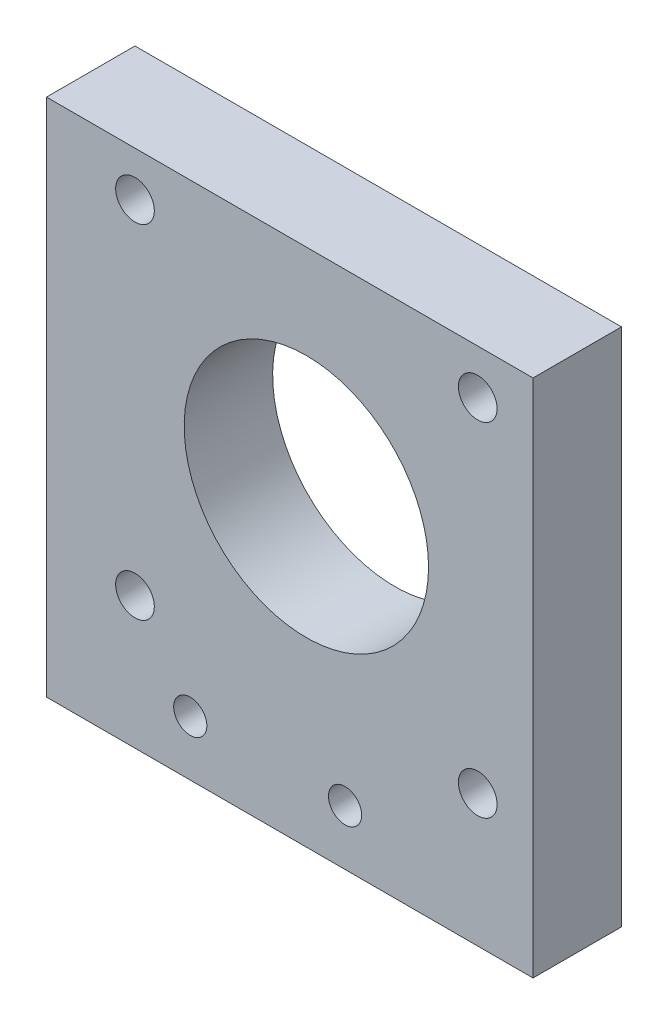
ISO-10303-21;
HEADER;
FILE_DESCRIPTION(('STEP AP214'),'2;1');
FILE_NAME('part.step','',(''),(''),'','','');
FILE_SCHEMA(('AUTOMOTIVE_DESIGN { 1 0 10303 214 1 1 1 1 }'));
ENDSEC;
DATA;
#1=APPLICATION_CONTEXT('core data for automotive mechanical design processes');
#2=APPLICATION_PROTOCOL_DEFINITION('international standard','automotive_design',2000,#1);
#3=PRODUCT_CONTEXT('',#1,'mechanical');
#4=PRODUCT('Part','Part','',(#3));
#5=PRODUCT_RELATED_PRODUCT_CATEGORY('part','',(#4));
#6=PRODUCT_DEFINITION_FORMATION('','',#4);
#7=PRODUCT_DEFINITION_CONTEXT('part definition',#1,'design');
#8=PRODUCT_DEFINITION('design','',#6,#7);
#9=PRODUCT_DEFINITION_SHAPE('','',#8);
#10=(LENGTH_UNIT() NAMED_UNIT(*) SI_UNIT(.MILLI.,.METRE.));
#11=(NAMED_UNIT(*) PLANE_ANGLE_UNIT() SI_UNIT($,.RADIAN.));
#12=(NAMED_UNIT(*) SI_UNIT($,.STERADIAN.) SOLID_ANGLE_UNIT());
#13=UNCERTAINTY_MEASURE_WITH_UNIT(LENGTH_MEASURE(1.E-05),#10,'distance_accuracy_value','');
#14=(GEOMETRIC_REPRESENTATION_CONTEXT(3) GLOBAL_UNCERTAINTY_ASSIGNED_CONTEXT((#13)) GLOBAL_UNIT_ASSIGNED_CONTEXT((#10,
#11,#12)) REPRESENTATION_CONTEXT('',''));
#15=CARTESIAN_POINT('',(0.,0.,0.));
#16=DIRECTION('',(0.,0.,1.));
#17=DIRECTION('',(1.,0.,0.));
#18=AXIS2_PLACEMENT_3D('',#15,#16,#17);
#19=CARTESIAN_POINT('',(-31.,-3.29999999999691,4.57445627922474));
#20=DIRECTION('',(0.,0.,-1.));
#21=DIRECTION('',(0.,1.,0.));
#22=AXIS2_PLACEMENT_3D('',#19,#20,#21);
#23=CYLINDRICAL_SURFACE('',#22,1.5);
#24=CARTESIAN_POINT('',(-31.,-3.29999999999691,4.57345627922474));
#25=DIRECTION('',(0.,0.,1.));
#26=DIRECTION('',(1.,0.,0.));
#27=AXIS2_PLACEMENT_3D('',#24,#25,#26);
#28=CIRCLE('',#27,1.5);
#29=CARTESIAN_POINT('',(-29.5,-3.29999999999691,4.57345627922474));
#30=VERTEX_POINT('',#29);
#31=EDGE_CURVE('E117',#30,#30,#28,.F.);
#32=ORIENTED_EDGE('',*,*,#31,.F.);
#33=EDGE_LOOP('',(#32));
#34=FACE_BOUND('',#33,.T.);
#35=CARTESIAN_POINT('',(-31.,-3.29999999999691,0.573456279224724));
#36=DIRECTION('',(0.,0.,-1.));
#37=DIRECTION('',(0.,1.,0.));
#38=AXIS2_PLACEMENT_3D('',#35,#36,#37);
#39=CIRCLE('',#38,1.5);
#40=CARTESIAN_POINT('',(-31.,-1.79999999999691,0.573456279224724));
#41=VERTEX_POINT('',#40);
#42=EDGE_CURVE('E41',#41,#41,#39,.F.);
#43=ORIENTED_EDGE('',*,*,#42,.F.);
#44=EDGE_LOOP('',(#43));
#45=FACE_BOUND('',#44,.T.);
#46=ADVANCED_FACE('F37',(#34,#45),#23,.F.);
#47=CARTESIAN_POINT('',(-17.,-3.29999999999691,4.57445627922474));
#48=DIRECTION('',(0.,0.,-1.));
#49=DIRECTION('',(0.,1.,0.));
#50=AXIS2_PLACEMENT_3D('',#47,#48,#49);
#51=CYLINDRICAL_SURFACE('',#50,1.5);
#52=CARTESIAN_POINT('',(-17.,-3.29999999999691,4.57345627922474));
#53=DIRECTION('',(0.,0.,1.));
#54=DIRECTION('',(1.,0.,0.));
#55=AXIS2_PLACEMENT_3D('',#52,#53,#54);
#56=CIRCLE('',#55,1.5);
#57=CARTESIAN_POINT('',(-15.5,-3.29999999999691,4.57345627922474));
#58=VERTEX_POINT('',#57);
#59=EDGE_CURVE('E122',#58,#58,#56,.F.);
#60=ORIENTED_EDGE('',*,*,#59,.F.);
#61=EDGE_LOOP('',(#60));
#62=FACE_BOUND('',#61,.T.);
#63=CARTESIAN_POINT('',(-17.,-3.29999999999691,0.573456279224724));
#64=DIRECTION('',(0.,0.,-1.));
#65=DIRECTION('',(0.,1.,0.));
#66=AXIS2_PLACEMENT_3D('',#63,#64,#65);
#67=CIRCLE('',#66,1.5);
#68=CARTESIAN_POINT('',(-17.,-1.79999999999691,0.573456279224724));
#69=VERTEX_POINT('',#68);
#70=EDGE_CURVE('E115',#69,#69,#67,.F.);
#71=ORIENTED_EDGE('',*,*,#70,.F.);
#72=EDGE_LOOP('',(#71));
#73=FACE_BOUND('',#72,.T.);
#74=ADVANCED_FACE('F177',(#62,#73),#51,.F.);
#75=CARTESIAN_POINT('',(-44.,38.7000000000031,-3.42654372077526));
#76=DIRECTION('',(0.,0.,-1.));
#77=DIRECTION('',(0.,1.,0.));
#78=AXIS2_PLACEMENT_3D('',#75,#76,#77);
#79=PLANE('',#78);
#80=CARTESIAN_POINT('',(-31.,-3.29999999999691,-3.42654372077528));
#81=DIRECTION('',(0.,0.,-1.));
#82=DIRECTION('',(0.,1.,0.));
#83=AXIS2_PLACEMENT_3D('',#80,#81,#82);
#84=CIRCLE('',#83,3.);
#85=CARTESIAN_POINT('',(-31.,-0.299999999996906,-3.42654372077528));
#86=VERTEX_POINT('',#85);
#87=EDGE_CURVE('E132',#86,#86,#84,.T.);
#88=ORIENTED_EDGE('',*,*,#87,.F.);
#89=EDGE_LOOP('',(#88));
#90=FACE_BOUND('',#89,.T.);
#91=CARTESIAN_POINT('',(-17.,-3.29999999999691,-3.42654372077528));
#92=DIRECTION('',(0.,0.,-1.));
#93=DIRECTION('',(0.,1.,0.));
#94=AXIS2_PLACEMENT_3D('',#91,#92,#93);
#95=CIRCLE('',#94,3.);
#96=CARTESIAN_POINT('',(-17.,-0.299999999996911,-3.42654372077528));
#97=VERTEX_POINT('',#96);
#98=EDGE_CURVE('E125',#97,#97,#95,.T.);
#99=ORIENTED_EDGE('',*,*,#98,.F.);
#100=EDGE_LOOP('',(#99));
#101=FACE_BOUND('',#100,.T.);
#102=CARTESIAN_POINT('',(-36.,34.6590604354951,-3.42654372077526));
#103=DIRECTION('',(0.,0.,-1.));
#104=DIRECTION('',(0.,1.,0.));
#105=AXIS2_PLACEMENT_3D('',#102,#103,#104);
#106=CIRCLE('',#105,1.75);
#107=CARTESIAN_POINT('',(-36.,36.4090604354951,-3.42654372077526));
#108=VERTEX_POINT('',#107);
#109=EDGE_CURVE('E135',#108,#108,#106,.T.);
#110=ORIENTED_EDGE('',*,*,#109,.F.);
#111=EDGE_LOOP('',(#110));
#112=FACE_BOUND('',#111,.T.);
#113=CARTESIAN_POINT('',(-36.,3.65906043549506,-3.42654372077527));
#114=DIRECTION('',(0.,0.,-1.));
#115=DIRECTION('',(0.,1.,0.));
#116=AXIS2_PLACEMENT_3D('',#113,#114,#115);
#117=CIRCLE('',#116,1.75);
#118=CARTESIAN_POINT('',(-36.,5.40906043549507,-3.42654372077527));
#119=VERTEX_POINT('',#118);
#120=EDGE_CURVE('E157',#119,#119,#117,.T.);
#121=ORIENTED_EDGE('',*,*,#120,.F.);
#122=EDGE_LOOP('',(#121));
#123=FACE_BOUND('',#122,.T.);
#124=CARTESIAN_POINT('',(-5.,3.65906043549506,-3.42654372077527));
#125=DIRECTION('',(0.,0.,-1.));
#126=DIRECTION('',(0.,1.,0.));
#127=AXIS2_PLACEMENT_3D('',#124,#125,#126);
#128=CIRCLE('',#127,1.75);
#129=CARTESIAN_POINT('',(-5.,5.40906043549506,-3.42654372077527));
#130=VERTEX_POINT('',#129);
#131=EDGE_CURVE('E151',#130,#130,#128,.T.);
#132=ORIENTED_EDGE('',*,*,#131,.F.);
#133=EDGE_LOOP('',(#132));
#134=FACE_BOUND('',#133,.T.);
#135=CARTESIAN_POINT('',(-5.,34.6590604354951,-3.42654372077526));
#136=DIRECTION('',(0.,0.,-1.));
#137=DIRECTION('',(0.,1.,0.));
#138=AXIS2_PLACEMENT_3D('',#135,#136,#137);
#139=CIRCLE('',#138,1.75000000000001);
#140=CARTESIAN_POINT('',(-5.,36.4090604354951,-3.42654372077526));
#141=VERTEX_POINT('',#140);
#142=EDGE_CURVE('E144',#141,#141,#139,.T.);
#143=ORIENTED_EDGE('',*,*,#142,.F.);
#144=EDGE_LOOP('',(#143));
#145=FACE_BOUND('',#144,.T.);
#146=CARTESIAN_POINT('',(-20.5,19.1590604354951,-3.42654372077527));
#147=DIRECTION('',(0.,0.,-1.));
#148=DIRECTION('',(0.,1.,0.));
#149=AXIS2_PLACEMENT_3D('',#146,#147,#148);
#150=CIRCLE('',#149,11.05);
#151=CARTESIAN_POINT('',(-20.5,30.209060435495,-3.42654372077527));
#152=VERTEX_POINT('',#151);
#153=EDGE_CURVE('E109',#152,#152,#150,.T.);
#154=ORIENTED_EDGE('',*,*,#153,.F.);
#155=EDGE_LOOP('',(#154));
#156=FACE_BOUND('',#155,.T.);
#157=DIRECTION('',(0.,1.,0.));
#158=VECTOR('',#157,1.);
#159=CARTESIAN_POINT('',(0.,38.7000000000031,-3.42654372077526));
#160=LINE('',#159,#158);
#161=CARTESIAN_POINT('',(0.,-8.29999999999691,-3.42654372077528));
#162=VERTEX_POINT('',#161);
#163=CARTESIAN_POINT('',(0.,38.7000000000031,-3.42654372077526));
#164=VERTEX_POINT('',#163);
#165=EDGE_CURVE('E105',#162,#164,#160,.T.);
#166=ORIENTED_EDGE('',*,*,#165,.F.);
#167=DIRECTION('',(1.,0.,0.));
#168=VECTOR('',#167,1.);
#169=CARTESIAN_POINT('',(-44.,-8.29999999999691,-3.42654372077528));
#170=LINE('',#169,#168);
#171=CARTESIAN_POINT('',(-44.,-8.29999999999691,-3.42654372077528));
#172=VERTEX_POINT('',#171);
#173=EDGE_CURVE('E11',#172,#162,#170,.T.);
#174=ORIENTED_EDGE('',*,*,#173,.F.);
#175=DIRECTION('',(0.,1.,0.));
#176=VECTOR('',#175,1.);
#177=CARTESIAN_POINT('',(-44.,38.7000000000031,-3.42654372077526));
#178=LINE('',#177,#176);
#179=CARTESIAN_POINT('',(-44.,38.7000000000031,-3.42654372077526));
#180=VERTEX_POINT('',#179);
#181=EDGE_CURVE('E98',#172,#180,#178,.T.);
#182=ORIENTED_EDGE('',*,*,#181,.T.);
#183=DIRECTION('',(1.,0.,0.));
#184=VECTOR('',#183,1.);
#185=CARTESIAN_POINT('',(-44.,38.7000000000031,-3.42654372077526));
#186=LINE('',#185,#184);
#187=EDGE_CURVE('E81',#180,#164,#186,.T.);
#188=ORIENTED_EDGE('',*,*,#187,.T.);
#189=EDGE_LOOP('',(#166,#174,#182,#188));
#190=FACE_BOUND('',#189,.T.);
#191=ADVANCED_FACE('F39',(#90,#101,#112,#123,#134,#145,#156,#190),#79,.T.);
#192=CARTESIAN_POINT('',(-44.,-8.29999999999691,4.57345627922474));
#193=DIRECTION('',(0.,-1.,0.));
#194=DIRECTION('',(0.,0.,-1.));
#195=AXIS2_PLACEMENT_3D('',#192,#193,#194);
#196=PLANE('',#195);
#197=DIRECTION('',(0.,0.,-1.));
#198=VECTOR('',#197,1.);
#199=CARTESIAN_POINT('',(0.,-8.29999999999691,4.57345627922474));
#200=LINE('',#199,#198);
#201=CARTESIAN_POINT('',(0.,-8.29999999999691,4.57345627922474));
#202=VERTEX_POINT('',#201);
#203=EDGE_CURVE('E100',#202,#162,#200,.T.);
#204=ORIENTED_EDGE('',*,*,#203,.F.);
#205=DIRECTION('',(1.,0.,0.));
#206=VECTOR('',#205,1.);
#207=CARTESIAN_POINT('',(-44.,-8.29999999999691,4.57345627922474));
#208=LINE('',#207,#206);
#209=CARTESIAN_POINT('',(-44.,-8.29999999999691,4.57345627922474));
#210=VERTEX_POINT('',#209);
#211=EDGE_CURVE('E47',#210,#202,#208,.T.);
#212=ORIENTED_EDGE('',*,*,#211,.F.);
#213=DIRECTION('',(0.,0.,-1.));
#214=VECTOR('',#213,1.);
#215=CARTESIAN_POINT('',(-44.,-8.29999999999691,4.57345627922474));
#216=LINE('',#215,#214);
#217=EDGE_CURVE('E95',#210,#172,#216,.T.);
#218=ORIENTED_EDGE('',*,*,#217,.T.);
#219=ORIENTED_EDGE('',*,*,#173,.T.);
#220=EDGE_LOOP('',(#204,#212,#218,#219));
#221=FACE_BOUND('',#220,.T.);
#222=ADVANCED_FACE('F176',(#221),#196,.T.);
#223=CARTESIAN_POINT('',(-44.,-8.29999999999691,4.57345627922474));
#224=DIRECTION('',(0.,0.,1.));
#225=DIRECTION('',(1.,0.,0.));
#226=AXIS2_PLACEMENT_3D('',#223,#224,#225);
#227=PLANE('',#226);
#228=ORIENTED_EDGE('',*,*,#31,.T.);
#229=EDGE_LOOP('',(#228));
#230=FACE_BOUND('',#229,.T.);
#231=ORIENTED_EDGE('',*,*,#59,.T.);
#232=EDGE_LOOP('',(#231));
#233=FACE_BOUND('',#232,.T.);
#234=CARTESIAN_POINT('',(-36.,34.6590604354951,4.57345627922474));
#235=DIRECTION('',(0.,0.,1.));
#236=DIRECTION('',(1.,0.,0.));
#237=AXIS2_PLACEMENT_3D('',#234,#235,#236);
#238=CIRCLE('',#237,1.75);
#239=CARTESIAN_POINT('',(-34.25,34.6590604354951,4.57345627922474));
#240=VERTEX_POINT('',#239);
#241=EDGE_CURVE('E139',#240,#240,#238,.F.);
#242=ORIENTED_EDGE('',*,*,#241,.T.);
#243=EDGE_LOOP('',(#242));
#244=FACE_BOUND('',#243,.T.);
#245=CARTESIAN_POINT('',(-36.,3.65906043549506,4.57345627922474));
#246=DIRECTION('',(0.,0.,1.));
#247=DIRECTION('',(1.,0.,0.));
#248=AXIS2_PLACEMENT_3D('',#245,#246,#247);
#249=CIRCLE('',#248,1.75);
#250=CARTESIAN_POINT('',(-34.25,3.65906043549506,4.57345627922474));
#251=VERTEX_POINT('',#250);
#252=EDGE_CURVE('E138',#251,#251,#249,.F.);
#253=ORIENTED_EDGE('',*,*,#252,.T.);
#254=EDGE_LOOP('',(#253));
#255=FACE_BOUND('',#254,.T.);
#256=CARTESIAN_POINT('',(-5.,3.65906043549505,4.57345627922474));
#257=DIRECTION('',(0.,0.,1.));
#258=DIRECTION('',(1.,0.,0.));
#259=AXIS2_PLACEMENT_3D('',#256,#257,#258);
#260=CIRCLE('',#259,1.75);
#261=CARTESIAN_POINT('',(-3.25,3.65906043549505,4.57345627922474));
#262=VERTEX_POINT('',#261);
#263=EDGE_CURVE('E154',#262,#262,#260,.F.);
#264=ORIENTED_EDGE('',*,*,#263,.T.);
#265=EDGE_LOOP('',(#264));
#266=FACE_BOUND('',#265,.T.);
#267=CARTESIAN_POINT('',(-5.,34.6590604354951,4.57345627922474));
#268=DIRECTION('',(0.,0.,1.));
#269=DIRECTION('',(1.,0.,0.));
#270=AXIS2_PLACEMENT_3D('',#267,#268,#269);
#271=CIRCLE('',#270,1.75000000000001);
#272=CARTESIAN_POINT('',(-3.25,34.6590604354951,4.57345627922474));
#273=VERTEX_POINT('',#272);
#274=EDGE_CURVE('E148',#273,#273,#271,.F.);
#275=ORIENTED_EDGE('',*,*,#274,.T.);
#276=EDGE_LOOP('',(#275));
#277=FACE_BOUND('',#276,.T.);
#278=CARTESIAN_POINT('',(-20.5,19.1590604354951,4.57345627922474));
#279=DIRECTION('',(0.,0.,1.));
#280=DIRECTION('',(1.,0.,0.));
#281=AXIS2_PLACEMENT_3D('',#278,#279,#280);
#282=CIRCLE('',#281,11.05);
#283=CARTESIAN_POINT('',(-9.45000000000001,19.1590604354951,4.57345627922474));
#284=VERTEX_POINT('',#283);
#285=EDGE_CURVE('E147',#284,#284,#282,.F.);
#286=ORIENTED_EDGE('',*,*,#285,.T.);
#287=EDGE_LOOP('',(#286));
#288=FACE_BOUND('',#287,.T.);
#289=DIRECTION('',(0.,-1.,0.));
#290=VECTOR('',#289,1.);
#291=CARTESIAN_POINT('',(0.,-8.29999999999691,4.57345627922474));
#292=LINE('',#291,#290);
#293=CARTESIAN_POINT('',(0.,38.7000000000031,4.57345627922474));
#294=VERTEX_POINT('',#293);
#295=EDGE_CURVE('E89',#294,#202,#292,.T.);
#296=ORIENTED_EDGE('',*,*,#295,.F.);
#297=DIRECTION('',(1.,0.,0.));
#298=VECTOR('',#297,1.);
#299=CARTESIAN_POINT('',(-44.,38.7000000000031,4.57345627922474));
#300=LINE('',#299,#298);
#301=CARTESIAN_POINT('',(-44.,38.7000000000031,4.57345627922474));
#302=VERTEX_POINT('',#301);
#303=EDGE_CURVE('E84',#302,#294,#300,.T.);
#304=ORIENTED_EDGE('',*,*,#303,.F.);
#305=DIRECTION('',(0.,-1.,0.));
#306=VECTOR('',#305,1.);
#307=CARTESIAN_POINT('',(-44.,-8.29999999999691,4.57345627922474));
#308=LINE('',#307,#306);
#309=EDGE_CURVE('E87',#302,#210,#308,.T.);
#310=ORIENTED_EDGE('',*,*,#309,.T.);
#311=ORIENTED_EDGE('',*,*,#211,.T.);
#312=EDGE_LOOP('',(#296,#304,#310,#311));
#313=FACE_BOUND('',#312,.T.);
#314=ADVANCED_FACE('F86',(#230,#233,#244,#255,#266,#277,#288,#313),#227,.T.);
#315=CARTESIAN_POINT('',(-44.,38.7000000000031,4.57345627922474));
#316=DIRECTION('',(0.,1.,0.));
#317=DIRECTION('',(0.,0.,1.));
#318=AXIS2_PLACEMENT_3D('',#315,#316,#317);
#319=PLANE('',#318);
#320=DIRECTION('',(0.,0.,1.));
#321=VECTOR('',#320,1.);
#322=CARTESIAN_POINT('',(0.,38.7000000000031,4.57345627922474));
#323=LINE('',#322,#321);
#324=EDGE_CURVE('E108',#164,#294,#323,.T.);
#325=ORIENTED_EDGE('',*,*,#324,.F.);
#326=ORIENTED_EDGE('',*,*,#187,.F.);
#327=DIRECTION('',(0.,0.,1.));
#328=VECTOR('',#327,1.);
#329=CARTESIAN_POINT('',(-44.,38.7000000000031,4.57345627922474));
#330=LINE('',#329,#328);
#331=EDGE_CURVE('E94',#180,#302,#330,.T.);
#332=ORIENTED_EDGE('',*,*,#331,.T.);
#333=ORIENTED_EDGE('',*,*,#303,.T.);
#334=EDGE_LOOP('',(#325,#326,#332,#333));
#335=FACE_BOUND('',#334,.T.);
#336=ADVANCED_FACE('F97',(#335),#319,.T.);
#337=CARTESIAN_POINT('',(-44.,0.,0.));
#338=DIRECTION('',(1.,0.,0.));
#339=DIRECTION('',(0.,0.,-1.));
#340=AXIS2_PLACEMENT_3D('',#337,#338,#339);
#341=PLANE('',#340);
#342=ORIENTED_EDGE('',*,*,#181,.F.);
#343=ORIENTED_EDGE('',*,*,#217,.F.);
#344=ORIENTED_EDGE('',*,*,#309,.F.);
#345=ORIENTED_EDGE('',*,*,#331,.F.);
#346=EDGE_LOOP('',(#342,#343,#344,#345));
#347=FACE_BOUND('',#346,.T.);
#348=ADVANCED_FACE('F93',(#347),#341,.F.);
#349=CARTESIAN_POINT('',(0.,0.,0.));
#350=DIRECTION('',(1.,0.,0.));
#351=DIRECTION('',(0.,0.,-1.));
#352=AXIS2_PLACEMENT_3D('',#349,#350,#351);
#353=PLANE('',#352);
#354=ORIENTED_EDGE('',*,*,#165,.T.);
#355=ORIENTED_EDGE('',*,*,#324,.T.);
#356=ORIENTED_EDGE('',*,*,#295,.T.);
#357=ORIENTED_EDGE('',*,*,#203,.T.);
#358=EDGE_LOOP('',(#354,#355,#356,#357));
#359=FACE_BOUND('',#358,.T.);
#360=ADVANCED_FACE('F171',(#359),#353,.T.);
#361=CARTESIAN_POINT('',(-20.5,19.1590604354951,4.57445627922475));
#362=DIRECTION('',(0.,0.,-1.));
#363=DIRECTION('',(0.,1.,0.));
#364=AXIS2_PLACEMENT_3D('',#361,#362,#363);
#365=CYLINDRICAL_SURFACE('',#364,11.05);
#366=ORIENTED_EDGE('',*,*,#285,.F.);
#367=EDGE_LOOP('',(#366));
#368=FACE_BOUND('',#367,.T.);
#369=ORIENTED_EDGE('',*,*,#153,.T.);
#370=EDGE_LOOP('',(#369));
#371=FACE_BOUND('',#370,.T.);
#372=ADVANCED_FACE('F167',(#368,#371),#365,.F.);
#373=CARTESIAN_POINT('',(-5.,34.6590604354951,4.57445627922475));
#374=DIRECTION('',(0.,0.,-1.));
#375=DIRECTION('',(0.,1.,0.));
#376=AXIS2_PLACEMENT_3D('',#373,#374,#375);
#377=CYLINDRICAL_SURFACE('',#376,1.75000000000001);
#378=ORIENTED_EDGE('',*,*,#274,.F.);
#379=EDGE_LOOP('',(#378));
#380=FACE_BOUND('',#379,.T.);
#381=ORIENTED_EDGE('',*,*,#142,.T.);
#382=EDGE_LOOP('',(#381));
#383=FACE_BOUND('',#382,.T.);
#384=ADVANCED_FACE('F170',(#380,#383),#377,.F.);
#385=CARTESIAN_POINT('',(-5.,3.65906043549505,4.57445627922474));
#386=DIRECTION('',(0.,0.,-1.));
#387=DIRECTION('',(0.,1.,0.));
#388=AXIS2_PLACEMENT_3D('',#385,#386,#387);
#389=CYLINDRICAL_SURFACE('',#388,1.75);
#390=ORIENTED_EDGE('',*,*,#263,.F.);
#391=EDGE_LOOP('',(#390));
#392=FACE_BOUND('',#391,.T.);
#393=ORIENTED_EDGE('',*,*,#131,.T.);
#394=EDGE_LOOP('',(#393));
#395=FACE_BOUND('',#394,.T.);
#396=ADVANCED_FACE('F202',(#392,#395),#389,.F.);
#397=CARTESIAN_POINT('',(-36.,3.65906043549506,4.57445627922474));
#398=DIRECTION('',(0.,0.,-1.));
#399=DIRECTION('',(0.,1.,0.));
#400=AXIS2_PLACEMENT_3D('',#397,#398,#399);
#401=CYLINDRICAL_SURFACE('',#400,1.75);
#402=ORIENTED_EDGE('',*,*,#252,.F.);
#403=EDGE_LOOP('',(#402));
#404=FACE_BOUND('',#403,.T.);
#405=ORIENTED_EDGE('',*,*,#120,.T.);
#406=EDGE_LOOP('',(#405));
#407=FACE_BOUND('',#406,.T.);
#408=ADVANCED_FACE('F206',(#404,#407),#401,.F.);
#409=CARTESIAN_POINT('',(-36.,34.6590604354951,4.57445627922475));
#410=DIRECTION('',(0.,0.,-1.));
#411=DIRECTION('',(0.,1.,0.));
#412=AXIS2_PLACEMENT_3D('',#409,#410,#411);
#413=CYLINDRICAL_SURFACE('',#412,1.75);
#414=ORIENTED_EDGE('',*,*,#241,.F.);
#415=EDGE_LOOP('',(#414));
#416=FACE_BOUND('',#415,.T.);
#417=ORIENTED_EDGE('',*,*,#109,.T.);
#418=EDGE_LOOP('',(#417));
#419=FACE_BOUND('',#418,.T.);
#420=ADVANCED_FACE('F209',(#416,#419),#413,.F.);
#421=CARTESIAN_POINT('',(-17.,-3.29999999999691,0.573456279224724));
#422=DIRECTION('',(0.,0.,-1.));
#423=DIRECTION('',(0.,1.,0.));
#424=AXIS2_PLACEMENT_3D('',#421,#422,#423);
#425=PLANE('',#424);
#426=CARTESIAN_POINT('',(-17.,-3.29999999999691,0.573456279224724));
#427=DIRECTION('',(0.,0.,-1.));
#428=DIRECTION('',(0.,1.,0.));
#429=AXIS2_PLACEMENT_3D('',#426,#427,#428);
#430=CIRCLE('',#429,3.);
#431=CARTESIAN_POINT('',(-17.,-0.299999999996912,0.573456279224725));
#432=VERTEX_POINT('',#431);
#433=EDGE_CURVE('E118',#432,#432,#430,.T.);
#434=ORIENTED_EDGE('',*,*,#433,.T.);
#435=EDGE_LOOP('',(#434));
#436=FACE_BOUND('',#435,.T.);
#437=ORIENTED_EDGE('',*,*,#70,.T.);
#438=EDGE_LOOP('',(#437));
#439=FACE_BOUND('',#438,.T.);
#440=ADVANCED_FACE('F242',(#436,#439),#425,.T.);
#441=CARTESIAN_POINT('',(-17.,-3.29999999999691,0.573456279224724));
#442=DIRECTION('',(0.,0.,-1.));
#443=DIRECTION('',(0.,1.,0.));
#444=AXIS2_PLACEMENT_3D('',#441,#442,#443);
#445=CYLINDRICAL_SURFACE('',#444,3.);
#446=ORIENTED_EDGE('',*,*,#433,.F.);
#447=EDGE_LOOP('',(#446));
#448=FACE_BOUND('',#447,.T.);
#449=ORIENTED_EDGE('',*,*,#98,.T.);
#450=EDGE_LOOP('',(#449));
#451=FACE_BOUND('',#450,.T.);
#452=ADVANCED_FACE('F249',(#448,#451),#445,.F.);
#453=CARTESIAN_POINT('',(-31.,-3.29999999999691,0.573456279224724));
#454=DIRECTION('',(0.,0.,-1.));
#455=DIRECTION('',(0.,1.,0.));
#456=AXIS2_PLACEMENT_3D('',#453,#454,#455);
#457=PLANE('',#456);
#458=CARTESIAN_POINT('',(-31.,-3.29999999999691,0.573456279224724));
#459=DIRECTION('',(0.,0.,-1.));
#460=DIRECTION('',(0.,1.,0.));
#461=AXIS2_PLACEMENT_3D('',#458,#459,#460);
#462=CIRCLE('',#461,3.);
#463=CARTESIAN_POINT('',(-31.,-0.299999999996908,0.573456279224725));
#464=VERTEX_POINT('',#463);
#465=EDGE_CURVE('E333',#464,#464,#462,.T.);
#466=ORIENTED_EDGE('',*,*,#465,.T.);
#467=EDGE_LOOP('',(#466));
#468=FACE_BOUND('',#467,.T.);
#469=ORIENTED_EDGE('',*,*,#42,.T.);
#470=EDGE_LOOP('',(#469));
#471=FACE_BOUND('',#470,.T.);
#472=ADVANCED_FACE('F257',(#468,#471),#457,.T.);
#473=CARTESIAN_POINT('',(-31.,-3.29999999999691,0.573456279224724));
#474=DIRECTION('',(0.,0.,-1.));
#475=DIRECTION('',(0.,1.,0.));
#476=AXIS2_PLACEMENT_3D('',#473,#474,#475);
#477=CYLINDRICAL_SURFACE('',#476,3.);
#478=ORIENTED_EDGE('',*,*,#465,.F.);
#479=EDGE_LOOP('',(#478));
#480=FACE_BOUND('',#479,.T.);
#481=ORIENTED_EDGE('',*,*,#87,.T.);
#482=EDGE_LOOP('',(#481));
#483=FACE_BOUND('',#482,.T.);
#484=ADVANCED_FACE('F265',(#480,#483),#477,.F.);
#485=CLOSED_SHELL('',(#46,#74,#191,#222,#314,#336,#348,#360,#372,#384,#396,#408,#420,#440,#452,
#472,#484));
#486=MANIFOLD_SOLID_BREP('B2',#485);
#487=ADVANCED_BREP_SHAPE_REPRESENTATION('',(#18,#486),#14);
#488=SHAPE_DEFINITION_REPRESENTATION(#9,#487);
ENDSEC;
END-ISO-10303-21;
